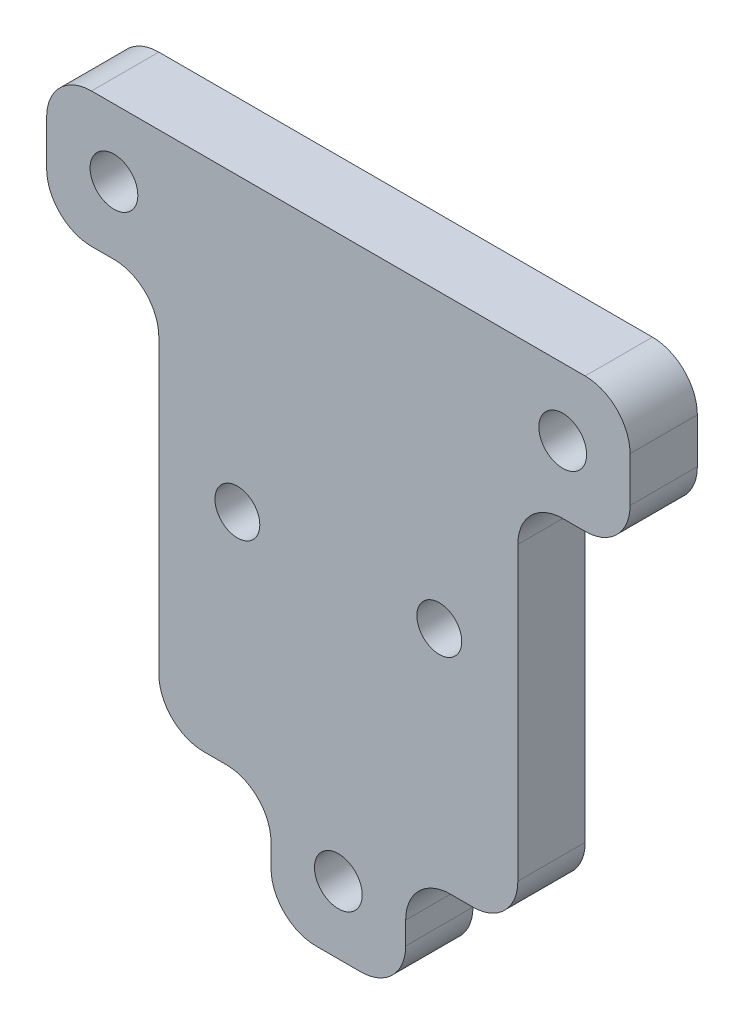
ISO-10303-21;
HEADER;
FILE_DESCRIPTION(('STEP AP214'),'2;1');
FILE_NAME('part.step','',(''),(''),'','','');
FILE_SCHEMA(('AUTOMOTIVE_DESIGN { 1 0 10303 214 1 1 1 1 }'));
ENDSEC;
DATA;
#1=APPLICATION_CONTEXT('core data for automotive mechanical design processes');
#2=APPLICATION_PROTOCOL_DEFINITION('international standard','automotive_design',2000,#1);
#3=PRODUCT_CONTEXT('',#1,'mechanical');
#4=PRODUCT('Part','Part','',(#3));
#5=PRODUCT_RELATED_PRODUCT_CATEGORY('part','',(#4));
#6=PRODUCT_DEFINITION_FORMATION('','',#4);
#7=PRODUCT_DEFINITION_CONTEXT('part definition',#1,'design');
#8=PRODUCT_DEFINITION('design','',#6,#7);
#9=PRODUCT_DEFINITION_SHAPE('','',#8);
#10=(LENGTH_UNIT() NAMED_UNIT(*) SI_UNIT(.MILLI.,.METRE.));
#11=(NAMED_UNIT(*) PLANE_ANGLE_UNIT() SI_UNIT($,.RADIAN.));
#12=(NAMED_UNIT(*) SI_UNIT($,.STERADIAN.) SOLID_ANGLE_UNIT());
#13=UNCERTAINTY_MEASURE_WITH_UNIT(LENGTH_MEASURE(1.E-05),#10,'distance_accuracy_value','');
#14=(GEOMETRIC_REPRESENTATION_CONTEXT(3) GLOBAL_UNCERTAINTY_ASSIGNED_CONTEXT((#13)) GLOBAL_UNIT_ASSIGNED_CONTEXT((#10,
#11,#12)) REPRESENTATION_CONTEXT('',''));
#15=CARTESIAN_POINT('',(0.,0.,0.));
#16=DIRECTION('',(0.,0.,1.));
#17=DIRECTION('',(1.,0.,0.));
#18=AXIS2_PLACEMENT_3D('',#15,#16,#17);
#19=CARTESIAN_POINT('',(0.,0.,0.));
#20=DIRECTION('',(0.,0.,-1.));
#21=DIRECTION('',(-1.,0.,0.));
#22=AXIS2_PLACEMENT_3D('',#19,#20,#21);
#23=PLANE('',#22);
#24=CARTESIAN_POINT('',(11.1125,31.75,0.));
#25=DIRECTION('',(0.,0.,1.));
#26=DIRECTION('',(1.,0.,0.));
#27=AXIS2_PLACEMENT_3D('',#24,#25,#26);
#28=CIRCLE('',#27,3.175);
#29=CARTESIAN_POINT('',(14.2875,31.75,0.));
#30=VERTEX_POINT('',#29);
#31=EDGE_CURVE('E881',#30,#30,#28,.T.);
#32=ORIENTED_EDGE('',*,*,#31,.T.);
#33=EDGE_LOOP('',(#32));
#34=FACE_BOUND('',#33,.T.);
#35=CARTESIAN_POINT('',(39.6875,31.75,0.));
#36=DIRECTION('',(0.,0.,1.));
#37=DIRECTION('',(1.,0.,0.));
#38=AXIS2_PLACEMENT_3D('',#35,#36,#37);
#39=CIRCLE('',#38,3.175);
#40=CARTESIAN_POINT('',(42.8625,31.75,0.));
#41=VERTEX_POINT('',#40);
#42=EDGE_CURVE('E873',#41,#41,#39,.T.);
#43=ORIENTED_EDGE('',*,*,#42,.T.);
#44=EDGE_LOOP('',(#43));
#45=FACE_BOUND('',#44,.T.);
#46=DIRECTION('',(-1.,0.,0.));
#47=VECTOR('',#46,1.);
#48=CARTESIAN_POINT('',(0.,73.025,0.));
#49=LINE('',#48,#47);
#50=CARTESIAN_POINT('',(60.325,73.025,0.));
#51=VERTEX_POINT('',#50);
#52=CARTESIAN_POINT('',(-9.52500000000001,73.025,0.));
#53=VERTEX_POINT('',#52);
#54=EDGE_CURVE('E218',#51,#53,#49,.T.);
#55=ORIENTED_EDGE('',*,*,#54,.F.);
#56=CARTESIAN_POINT('',(60.325,66.675,0.));
#57=DIRECTION('',(0.,0.,-1.));
#58=DIRECTION('',(-1.,0.,0.));
#59=AXIS2_PLACEMENT_3D('',#56,#57,#58);
#60=CIRCLE('',#59,6.35);
#61=CARTESIAN_POINT('',(66.675,66.675,0.));
#62=VERTEX_POINT('',#61);
#63=EDGE_CURVE('E288',#51,#62,#60,.T.);
#64=ORIENTED_EDGE('',*,*,#63,.T.);
#65=DIRECTION('',(0.,1.,0.));
#66=VECTOR('',#65,1.);
#67=CARTESIAN_POINT('',(66.675,73.025,0.));
#68=LINE('',#67,#66);
#69=CARTESIAN_POINT('',(66.675,60.325,0.));
#70=VERTEX_POINT('',#69);
#71=EDGE_CURVE('E483',#70,#62,#68,.T.);
#72=ORIENTED_EDGE('',*,*,#71,.F.);
#73=CARTESIAN_POINT('',(60.325,60.325,0.));
#74=DIRECTION('',(0.,0.,-1.));
#75=DIRECTION('',(-1.,0.,0.));
#76=AXIS2_PLACEMENT_3D('',#73,#74,#75);
#77=CIRCLE('',#76,6.35);
#78=CARTESIAN_POINT('',(60.325,53.975,0.));
#79=VERTEX_POINT('',#78);
#80=EDGE_CURVE('E291',#70,#79,#77,.T.);
#81=ORIENTED_EDGE('',*,*,#80,.T.);
#82=DIRECTION('',(1.,0.,0.));
#83=VECTOR('',#82,1.);
#84=CARTESIAN_POINT('',(50.8,53.975,0.));
#85=LINE('',#84,#83);
#86=CARTESIAN_POINT('',(57.15,53.975,0.));
#87=VERTEX_POINT('',#86);
#88=EDGE_CURVE('E476',#87,#79,#85,.T.);
#89=ORIENTED_EDGE('',*,*,#88,.F.);
#90=CARTESIAN_POINT('',(57.15,47.625,0.));
#91=DIRECTION('',(0.,0.,-1.));
#92=DIRECTION('',(-1.,0.,0.));
#93=AXIS2_PLACEMENT_3D('',#90,#91,#92);
#94=CIRCLE('',#93,6.35);
#95=CARTESIAN_POINT('',(50.8,47.625,0.));
#96=VERTEX_POINT('',#95);
#97=EDGE_CURVE('E390',#87,#96,#94,.F.);
#98=ORIENTED_EDGE('',*,*,#97,.T.);
#99=DIRECTION('',(0.,1.,0.));
#100=VECTOR('',#99,1.);
#101=CARTESIAN_POINT('',(50.8,0.,0.));
#102=LINE('',#101,#100);
#103=CARTESIAN_POINT('',(50.8,6.35,0.));
#104=VERTEX_POINT('',#103);
#105=EDGE_CURVE('E255',#104,#96,#102,.T.);
#106=ORIENTED_EDGE('',*,*,#105,.F.);
#107=CARTESIAN_POINT('',(44.45,6.35,0.));
#108=DIRECTION('',(0.,0.,-1.));
#109=DIRECTION('',(-1.,0.,0.));
#110=AXIS2_PLACEMENT_3D('',#107,#108,#109);
#111=CIRCLE('',#110,6.35);
#112=CARTESIAN_POINT('',(44.45,0.,0.));
#113=VERTEX_POINT('',#112);
#114=EDGE_CURVE('E294',#104,#113,#111,.T.);
#115=ORIENTED_EDGE('',*,*,#114,.T.);
#116=DIRECTION('',(1.,0.,0.));
#117=VECTOR('',#116,1.);
#118=CARTESIAN_POINT('',(0.,0.,0.));
#119=LINE('',#118,#117);
#120=CARTESIAN_POINT('',(41.275,0.,0.));
#121=VERTEX_POINT('',#120);
#122=EDGE_CURVE('E421',#121,#113,#119,.T.);
#123=ORIENTED_EDGE('',*,*,#122,.F.);
#124=CARTESIAN_POINT('',(41.275,-6.35,0.));
#125=DIRECTION('',(0.,0.,-1.));
#126=DIRECTION('',(-1.,0.,0.));
#127=AXIS2_PLACEMENT_3D('',#124,#125,#126);
#128=CIRCLE('',#127,6.35);
#129=CARTESIAN_POINT('',(34.925,-6.35,0.));
#130=VERTEX_POINT('',#129);
#131=EDGE_CURVE('E384',#121,#130,#128,.F.);
#132=ORIENTED_EDGE('',*,*,#131,.T.);
#133=DIRECTION('',(0.,1.,0.));
#134=VECTOR('',#133,1.);
#135=CARTESIAN_POINT('',(34.925,0.,0.));
#136=LINE('',#135,#134);
#137=CARTESIAN_POINT('',(34.925,-9.525,0.));
#138=VERTEX_POINT('',#137);
#139=EDGE_CURVE('E479',#138,#130,#136,.T.);
#140=ORIENTED_EDGE('',*,*,#139,.F.);
#141=CARTESIAN_POINT('',(28.575,-9.525,0.));
#142=DIRECTION('',(0.,0.,-1.));
#143=DIRECTION('',(-1.,0.,0.));
#144=AXIS2_PLACEMENT_3D('',#141,#142,#143);
#145=CIRCLE('',#144,6.35);
#146=CARTESIAN_POINT('',(28.575,-15.875,0.));
#147=VERTEX_POINT('',#146);
#148=EDGE_CURVE('E297',#138,#147,#145,.T.);
#149=ORIENTED_EDGE('',*,*,#148,.T.);
#150=DIRECTION('',(1.,0.,0.));
#151=VECTOR('',#150,1.);
#152=CARTESIAN_POINT('',(15.875,-15.875,0.));
#153=LINE('',#152,#151);
#154=CARTESIAN_POINT('',(22.225,-15.875,0.));
#155=VERTEX_POINT('',#154);
#156=EDGE_CURVE('E818',#155,#147,#153,.T.);
#157=ORIENTED_EDGE('',*,*,#156,.F.);
#158=CARTESIAN_POINT('',(22.225,-9.525,0.));
#159=DIRECTION('',(0.,0.,-1.));
#160=DIRECTION('',(-1.,0.,0.));
#161=AXIS2_PLACEMENT_3D('',#158,#159,#160);
#162=CIRCLE('',#161,6.35);
#163=CARTESIAN_POINT('',(15.875,-9.525,0.));
#164=VERTEX_POINT('',#163);
#165=EDGE_CURVE('E300',#155,#164,#162,.T.);
#166=ORIENTED_EDGE('',*,*,#165,.T.);
#167=DIRECTION('',(0.,-1.,0.));
#168=VECTOR('',#167,1.);
#169=CARTESIAN_POINT('',(15.875,0.,0.));
#170=LINE('',#169,#168);
#171=CARTESIAN_POINT('',(15.875,-6.35,0.));
#172=VERTEX_POINT('',#171);
#173=EDGE_CURVE('E470',#172,#164,#170,.T.);
#174=ORIENTED_EDGE('',*,*,#173,.F.);
#175=CARTESIAN_POINT('',(9.525,-6.35,0.));
#176=DIRECTION('',(0.,0.,-1.));
#177=DIRECTION('',(-1.,0.,0.));
#178=AXIS2_PLACEMENT_3D('',#175,#176,#177);
#179=CIRCLE('',#178,6.35);
#180=CARTESIAN_POINT('',(9.525,0.,0.));
#181=VERTEX_POINT('',#180);
#182=EDGE_CURVE('E378',#172,#181,#179,.F.);
#183=ORIENTED_EDGE('',*,*,#182,.T.);
#184=CARTESIAN_POINT('',(6.35,0.,0.));
#185=VERTEX_POINT('',#184);
#186=EDGE_CURVE('E428',#185,#181,#119,.T.);
#187=ORIENTED_EDGE('',*,*,#186,.F.);
#188=CARTESIAN_POINT('',(6.35,6.35,0.));
#189=DIRECTION('',(0.,0.,-1.));
#190=DIRECTION('',(-1.,0.,0.));
#191=AXIS2_PLACEMENT_3D('',#188,#189,#190);
#192=CIRCLE('',#191,6.35);
#193=CARTESIAN_POINT('',(0.,6.35,0.));
#194=VERTEX_POINT('',#193);
#195=EDGE_CURVE('E227',#185,#194,#192,.T.);
#196=ORIENTED_EDGE('',*,*,#195,.T.);
#197=DIRECTION('',(0.,-1.,0.));
#198=VECTOR('',#197,1.);
#199=CARTESIAN_POINT('',(0.,0.,0.));
#200=LINE('',#199,#198);
#201=CARTESIAN_POINT('',(0.,47.625,0.));
#202=VERTEX_POINT('',#201);
#203=EDGE_CURVE('E416',#202,#194,#200,.T.);
#204=ORIENTED_EDGE('',*,*,#203,.F.);
#205=CARTESIAN_POINT('',(-6.35,47.625,0.));
#206=DIRECTION('',(0.,0.,-1.));
#207=DIRECTION('',(-1.,0.,0.));
#208=AXIS2_PLACEMENT_3D('',#205,#206,#207);
#209=CIRCLE('',#208,6.35);
#210=CARTESIAN_POINT('',(-6.35,53.975,0.));
#211=VERTEX_POINT('',#210);
#212=EDGE_CURVE('E13',#202,#211,#209,.F.);
#213=ORIENTED_EDGE('',*,*,#212,.T.);
#214=DIRECTION('',(1.,0.,0.));
#215=VECTOR('',#214,1.);
#216=CARTESIAN_POINT('',(0.,53.975,0.));
#217=LINE('',#216,#215);
#218=CARTESIAN_POINT('',(-9.52500000000001,53.975,0.));
#219=VERTEX_POINT('',#218);
#220=EDGE_CURVE('E413',#219,#211,#217,.T.);
#221=ORIENTED_EDGE('',*,*,#220,.F.);
#222=CARTESIAN_POINT('',(-9.52500000000001,60.325,0.));
#223=DIRECTION('',(0.,0.,-1.));
#224=DIRECTION('',(-1.,0.,0.));
#225=AXIS2_PLACEMENT_3D('',#222,#223,#224);
#226=CIRCLE('',#225,6.35);
#227=CARTESIAN_POINT('',(-15.875,60.325,0.));
#228=VERTEX_POINT('',#227);
#229=EDGE_CURVE('E285',#219,#228,#226,.T.);
#230=ORIENTED_EDGE('',*,*,#229,.T.);
#231=DIRECTION('',(0.,-1.,0.));
#232=VECTOR('',#231,1.);
#233=CARTESIAN_POINT('',(-15.875,73.025,0.));
#234=LINE('',#233,#232);
#235=CARTESIAN_POINT('',(-15.875,66.675,0.));
#236=VERTEX_POINT('',#235);
#237=EDGE_CURVE('E221',#236,#228,#234,.T.);
#238=ORIENTED_EDGE('',*,*,#237,.F.);
#239=CARTESIAN_POINT('',(-9.52500000000001,66.675,0.));
#240=DIRECTION('',(0.,0.,-1.));
#241=DIRECTION('',(-1.,0.,0.));
#242=AXIS2_PLACEMENT_3D('',#239,#240,#241);
#243=CIRCLE('',#242,6.35);
#244=EDGE_CURVE('E215',#236,#53,#243,.T.);
#245=ORIENTED_EDGE('',*,*,#244,.T.);
#246=EDGE_LOOP('',(#55,#64,#72,#81,#89,#98,#106,#115,#123,#132,#140,#149,#157,#166,#174,#183,
#187,#196,#204,#213,#221,#230,#238,#245));
#247=FACE_BOUND('',#246,.T.);
#248=CARTESIAN_POINT('',(-6.35000000000001,63.5,0.));
#249=DIRECTION('',(0.,0.,1.));
#250=DIRECTION('',(1.,0.,0.));
#251=AXIS2_PLACEMENT_3D('',#248,#249,#250);
#252=CIRCLE('',#251,3.3782);
#253=CARTESIAN_POINT('',(-2.97180000000001,63.5,0.));
#254=VERTEX_POINT('',#253);
#255=EDGE_CURVE('E865',#254,#254,#252,.T.);
#256=ORIENTED_EDGE('',*,*,#255,.T.);
#257=EDGE_LOOP('',(#256));
#258=FACE_BOUND('',#257,.T.);
#259=CARTESIAN_POINT('',(57.15,63.5,0.));
#260=DIRECTION('',(0.,0.,1.));
#261=DIRECTION('',(1.,0.,0.));
#262=AXIS2_PLACEMENT_3D('',#259,#260,#261);
#263=CIRCLE('',#262,3.3782);
#264=CARTESIAN_POINT('',(60.5282,63.5,0.));
#265=VERTEX_POINT('',#264);
#266=EDGE_CURVE('E857',#265,#265,#263,.T.);
#267=ORIENTED_EDGE('',*,*,#266,.T.);
#268=EDGE_LOOP('',(#267));
#269=FACE_BOUND('',#268,.T.);
#270=CARTESIAN_POINT('',(25.4,-6.35,0.));
#271=DIRECTION('',(0.,0.,1.));
#272=DIRECTION('',(1.,0.,0.));
#273=AXIS2_PLACEMENT_3D('',#270,#271,#272);
#274=CIRCLE('',#273,3.3782);
#275=CARTESIAN_POINT('',(28.7782,-6.35,0.));
#276=VERTEX_POINT('',#275);
#277=EDGE_CURVE('E832',#276,#276,#274,.T.);
#278=ORIENTED_EDGE('',*,*,#277,.T.);
#279=EDGE_LOOP('',(#278));
#280=FACE_BOUND('',#279,.T.);
#281=ADVANCED_FACE('F54',(#34,#45,#247,#258,#269,#280),#23,.T.);
#282=CARTESIAN_POINT('',(0.,0.,9.525));
#283=DIRECTION('',(0.,1.,0.));
#284=DIRECTION('',(0.,0.,1.));
#285=AXIS2_PLACEMENT_3D('',#282,#283,#284);
#286=PLANE('',#285);
#287=DIRECTION('',(1.,0.,0.));
#288=VECTOR('',#287,1.);
#289=CARTESIAN_POINT('',(0.,0.,9.525));
#290=LINE('',#289,#288);
#291=CARTESIAN_POINT('',(41.275,0.,9.525));
#292=VERTEX_POINT('',#291);
#293=CARTESIAN_POINT('',(44.45,0.,9.525));
#294=VERTEX_POINT('',#293);
#295=EDGE_CURVE('E409',#292,#294,#290,.T.);
#296=ORIENTED_EDGE('',*,*,#295,.F.);
#297=DIRECTION('',(0.,0.,1.));
#298=VECTOR('',#297,1.);
#299=CARTESIAN_POINT('',(41.275,0.,9.525));
#300=LINE('',#299,#298);
#301=EDGE_CURVE('E342',#292,#121,#300,.F.);
#302=ORIENTED_EDGE('',*,*,#301,.T.);
#303=ORIENTED_EDGE('',*,*,#122,.T.);
#304=DIRECTION('',(0.,0.,-1.));
#305=VECTOR('',#304,1.);
#306=CARTESIAN_POINT('',(44.45,0.,9.525));
#307=LINE('',#306,#305);
#308=EDGE_CURVE('E339',#113,#294,#307,.F.);
#309=ORIENTED_EDGE('',*,*,#308,.T.);
#310=EDGE_LOOP('',(#296,#302,#303,#309));
#311=FACE_BOUND('',#310,.T.);
#312=ADVANCED_FACE('F444',(#311),#286,.F.);
#313=CARTESIAN_POINT('',(0.,0.,9.525));
#314=DIRECTION('',(1.,0.,0.));
#315=DIRECTION('',(0.,0.,-1.));
#316=AXIS2_PLACEMENT_3D('',#313,#314,#315);
#317=PLANE('',#316);
#318=ORIENTED_EDGE('',*,*,#203,.T.);
#319=DIRECTION('',(0.,0.,-1.));
#320=VECTOR('',#319,1.);
#321=CARTESIAN_POINT('',(0.,6.35,9.525));
#322=LINE('',#321,#320);
#323=CARTESIAN_POINT('',(0.,6.35,9.525));
#324=VERTEX_POINT('',#323);
#325=EDGE_CURVE('E315',#194,#324,#322,.F.);
#326=ORIENTED_EDGE('',*,*,#325,.T.);
#327=DIRECTION('',(0.,-1.,0.));
#328=VECTOR('',#327,1.);
#329=CARTESIAN_POINT('',(0.,0.,9.525));
#330=LINE('',#329,#328);
#331=CARTESIAN_POINT('',(0.,47.625,9.525));
#332=VERTEX_POINT('',#331);
#333=EDGE_CURVE('E399',#332,#324,#330,.T.);
#334=ORIENTED_EDGE('',*,*,#333,.F.);
#335=DIRECTION('',(0.,0.,1.));
#336=VECTOR('',#335,1.);
#337=CARTESIAN_POINT('',(0.,47.625,9.525));
#338=LINE('',#337,#336);
#339=EDGE_CURVE('E312',#332,#202,#338,.F.);
#340=ORIENTED_EDGE('',*,*,#339,.T.);
#341=EDGE_LOOP('',(#318,#326,#334,#340));
#342=FACE_BOUND('',#341,.T.);
#343=ADVANCED_FACE('F406',(#342),#317,.F.);
#344=CARTESIAN_POINT('',(6.35,0.,9.525));
#345=VERTEX_POINT('',#344);
#346=CARTESIAN_POINT('',(9.525,0.,9.525));
#347=VERTEX_POINT('',#346);
#348=EDGE_CURVE('E252',#345,#347,#290,.T.);
#349=ORIENTED_EDGE('',*,*,#348,.F.);
#350=DIRECTION('',(0.,0.,-1.));
#351=VECTOR('',#350,1.);
#352=CARTESIAN_POINT('',(6.35,0.,9.525));
#353=LINE('',#352,#351);
#354=EDGE_CURVE('E308',#345,#185,#353,.T.);
#355=ORIENTED_EDGE('',*,*,#354,.T.);
#356=ORIENTED_EDGE('',*,*,#186,.T.);
#357=DIRECTION('',(0.,0.,1.));
#358=VECTOR('',#357,1.);
#359=CARTESIAN_POINT('',(9.525,0.,9.525));
#360=LINE('',#359,#358);
#361=EDGE_CURVE('E226',#181,#347,#360,.T.);
#362=ORIENTED_EDGE('',*,*,#361,.T.);
#363=EDGE_LOOP('',(#349,#355,#356,#362));
#364=FACE_BOUND('',#363,.T.);
#365=ADVANCED_FACE('F524',(#364),#286,.F.);
#366=CARTESIAN_POINT('',(50.8,0.,9.525));
#367=DIRECTION('',(-1.,0.,0.));
#368=DIRECTION('',(0.,0.,1.));
#369=AXIS2_PLACEMENT_3D('',#366,#367,#368);
#370=PLANE('',#369);
#371=DIRECTION('',(0.,1.,0.));
#372=VECTOR('',#371,1.);
#373=CARTESIAN_POINT('',(50.8,0.,9.525));
#374=LINE('',#373,#372);
#375=CARTESIAN_POINT('',(50.8,6.35,9.525));
#376=VERTEX_POINT('',#375);
#377=CARTESIAN_POINT('',(50.8,47.625,9.525));
#378=VERTEX_POINT('',#377);
#379=EDGE_CURVE('E244',#376,#378,#374,.T.);
#380=ORIENTED_EDGE('',*,*,#379,.F.);
#381=DIRECTION('',(0.,0.,-1.));
#382=VECTOR('',#381,1.);
#383=CARTESIAN_POINT('',(50.8,6.35,9.525));
#384=LINE('',#383,#382);
#385=EDGE_CURVE('E349',#376,#104,#384,.T.);
#386=ORIENTED_EDGE('',*,*,#385,.T.);
#387=ORIENTED_EDGE('',*,*,#105,.T.);
#388=DIRECTION('',(0.,0.,1.));
#389=VECTOR('',#388,1.);
#390=CARTESIAN_POINT('',(50.8,47.625,9.525));
#391=LINE('',#390,#389);
#392=EDGE_CURVE('E345',#96,#378,#391,.T.);
#393=ORIENTED_EDGE('',*,*,#392,.T.);
#394=EDGE_LOOP('',(#380,#386,#387,#393));
#395=FACE_BOUND('',#394,.T.);
#396=ADVANCED_FACE('F453',(#395),#370,.F.);
#397=CARTESIAN_POINT('',(0.,0.,9.525));
#398=DIRECTION('',(0.,0.,-1.));
#399=DIRECTION('',(-1.,0.,0.));
#400=AXIS2_PLACEMENT_3D('',#397,#398,#399);
#401=PLANE('',#400);
#402=CARTESIAN_POINT('',(11.1125,31.75,9.525));
#403=DIRECTION('',(0.,0.,1.));
#404=DIRECTION('',(1.,0.,0.));
#405=AXIS2_PLACEMENT_3D('',#402,#403,#404);
#406=CIRCLE('',#405,3.17499999999999);
#407=CARTESIAN_POINT('',(14.2875,31.75,9.525));
#408=VERTEX_POINT('',#407);
#409=EDGE_CURVE('E884',#408,#408,#406,.T.);
#410=ORIENTED_EDGE('',*,*,#409,.F.);
#411=EDGE_LOOP('',(#410));
#412=FACE_BOUND('',#411,.T.);
#413=CARTESIAN_POINT('',(39.6875,31.75,9.525));
#414=DIRECTION('',(0.,0.,1.));
#415=DIRECTION('',(1.,0.,0.));
#416=AXIS2_PLACEMENT_3D('',#413,#414,#415);
#417=CIRCLE('',#416,3.17499999999998);
#418=CARTESIAN_POINT('',(42.8625,31.75,9.525));
#419=VERTEX_POINT('',#418);
#420=EDGE_CURVE('E877',#419,#419,#417,.T.);
#421=ORIENTED_EDGE('',*,*,#420,.F.);
#422=EDGE_LOOP('',(#421));
#423=FACE_BOUND('',#422,.T.);
#424=CARTESIAN_POINT('',(-6.35000000000001,63.5,9.525));
#425=DIRECTION('',(0.,0.,1.));
#426=DIRECTION('',(1.,0.,0.));
#427=AXIS2_PLACEMENT_3D('',#424,#425,#426);
#428=CIRCLE('',#427,3.3782);
#429=CARTESIAN_POINT('',(-2.97180000000001,63.5,9.525));
#430=VERTEX_POINT('',#429);
#431=EDGE_CURVE('E869',#430,#430,#428,.T.);
#432=ORIENTED_EDGE('',*,*,#431,.F.);
#433=EDGE_LOOP('',(#432));
#434=FACE_BOUND('',#433,.T.);
#435=CARTESIAN_POINT('',(57.15,63.5,9.525));
#436=DIRECTION('',(0.,0.,1.));
#437=DIRECTION('',(1.,0.,0.));
#438=AXIS2_PLACEMENT_3D('',#435,#436,#437);
#439=CIRCLE('',#438,3.3782);
#440=CARTESIAN_POINT('',(60.5282,63.5,9.525));
#441=VERTEX_POINT('',#440);
#442=EDGE_CURVE('E861',#441,#441,#439,.T.);
#443=ORIENTED_EDGE('',*,*,#442,.F.);
#444=EDGE_LOOP('',(#443));
#445=FACE_BOUND('',#444,.T.);
#446=CARTESIAN_POINT('',(25.4,-6.35,9.525));
#447=DIRECTION('',(0.,0.,1.));
#448=DIRECTION('',(1.,0.,0.));
#449=AXIS2_PLACEMENT_3D('',#446,#447,#448);
#450=CIRCLE('',#449,3.3782);
#451=CARTESIAN_POINT('',(28.7782,-6.35,9.525));
#452=VERTEX_POINT('',#451);
#453=EDGE_CURVE('E837',#452,#452,#450,.T.);
#454=ORIENTED_EDGE('',*,*,#453,.F.);
#455=EDGE_LOOP('',(#454));
#456=FACE_BOUND('',#455,.T.);
#457=CARTESIAN_POINT('',(60.325,66.675,9.525));
#458=DIRECTION('',(0.,0.,-1.));
#459=DIRECTION('',(-1.,0.,0.));
#460=AXIS2_PLACEMENT_3D('',#457,#458,#459);
#461=CIRCLE('',#460,6.35);
#462=CARTESIAN_POINT('',(66.675,66.675,9.525));
#463=VERTEX_POINT('',#462);
#464=CARTESIAN_POINT('',(60.325,73.025,9.525));
#465=VERTEX_POINT('',#464);
#466=EDGE_CURVE('E249',#463,#465,#461,.F.);
#467=ORIENTED_EDGE('',*,*,#466,.T.);
#468=DIRECTION('',(-1.,0.,0.));
#469=VECTOR('',#468,1.);
#470=CARTESIAN_POINT('',(0.,73.025,9.525));
#471=LINE('',#470,#469);
#472=CARTESIAN_POINT('',(-9.52500000000001,73.025,9.525));
#473=VERTEX_POINT('',#472);
#474=EDGE_CURVE('E487',#465,#473,#471,.T.);
#475=ORIENTED_EDGE('',*,*,#474,.T.);
#476=CARTESIAN_POINT('',(-9.52500000000001,66.675,9.525));
#477=DIRECTION('',(0.,0.,-1.));
#478=DIRECTION('',(-1.,0.,0.));
#479=AXIS2_PLACEMENT_3D('',#476,#477,#478);
#480=CIRCLE('',#479,6.35);
#481=CARTESIAN_POINT('',(-15.875,66.675,9.525));
#482=VERTEX_POINT('',#481);
#483=EDGE_CURVE('E241',#473,#482,#480,.F.);
#484=ORIENTED_EDGE('',*,*,#483,.T.);
#485=DIRECTION('',(0.,-1.,0.));
#486=VECTOR('',#485,1.);
#487=CARTESIAN_POINT('',(-15.875,73.025,9.525));
#488=LINE('',#487,#486);
#489=CARTESIAN_POINT('',(-15.875,60.325,9.525));
#490=VERTEX_POINT('',#489);
#491=EDGE_CURVE('E492',#482,#490,#488,.T.);
#492=ORIENTED_EDGE('',*,*,#491,.T.);
#493=CARTESIAN_POINT('',(-9.52500000000001,60.325,9.525));
#494=DIRECTION('',(0.,0.,-1.));
#495=DIRECTION('',(-1.,0.,0.));
#496=AXIS2_PLACEMENT_3D('',#493,#494,#495);
#497=CIRCLE('',#496,6.35);
#498=CARTESIAN_POINT('',(-9.52500000000001,53.975,9.525));
#499=VERTEX_POINT('',#498);
#500=EDGE_CURVE('E243',#490,#499,#497,.F.);
#501=ORIENTED_EDGE('',*,*,#500,.T.);
#502=DIRECTION('',(1.,0.,0.));
#503=VECTOR('',#502,1.);
#504=CARTESIAN_POINT('',(0.,53.975,9.525));
#505=LINE('',#504,#503);
#506=CARTESIAN_POINT('',(-6.35,53.975,9.525));
#507=VERTEX_POINT('',#506);
#508=EDGE_CURVE('E238',#499,#507,#505,.T.);
#509=ORIENTED_EDGE('',*,*,#508,.T.);
#510=CARTESIAN_POINT('',(-6.35,47.625,9.525));
#511=DIRECTION('',(0.,0.,-1.));
#512=DIRECTION('',(-1.,0.,0.));
#513=AXIS2_PLACEMENT_3D('',#510,#511,#512);
#514=CIRCLE('',#513,6.35);
#515=EDGE_CURVE('E63',#507,#332,#514,.T.);
#516=ORIENTED_EDGE('',*,*,#515,.T.);
#517=ORIENTED_EDGE('',*,*,#333,.T.);
#518=CARTESIAN_POINT('',(6.35,6.35,9.525));
#519=DIRECTION('',(0.,0.,-1.));
#520=DIRECTION('',(-1.,0.,0.));
#521=AXIS2_PLACEMENT_3D('',#518,#519,#520);
#522=CIRCLE('',#521,6.35);
#523=EDGE_CURVE('E273',#324,#345,#522,.F.);
#524=ORIENTED_EDGE('',*,*,#523,.T.);
#525=ORIENTED_EDGE('',*,*,#348,.T.);
#526=CARTESIAN_POINT('',(9.525,-6.35,9.525));
#527=DIRECTION('',(0.,0.,-1.));
#528=DIRECTION('',(-1.,0.,0.));
#529=AXIS2_PLACEMENT_3D('',#526,#527,#528);
#530=CIRCLE('',#529,6.35);
#531=CARTESIAN_POINT('',(15.875,-6.35,9.525));
#532=VERTEX_POINT('',#531);
#533=EDGE_CURVE('E375',#347,#532,#530,.T.);
#534=ORIENTED_EDGE('',*,*,#533,.T.);
#535=DIRECTION('',(0.,-1.,0.));
#536=VECTOR('',#535,1.);
#537=CARTESIAN_POINT('',(15.875,0.,9.525));
#538=LINE('',#537,#536);
#539=CARTESIAN_POINT('',(15.875,-9.525,9.525));
#540=VERTEX_POINT('',#539);
#541=EDGE_CURVE('E812',#532,#540,#538,.T.);
#542=ORIENTED_EDGE('',*,*,#541,.T.);
#543=CARTESIAN_POINT('',(22.225,-9.525,9.525));
#544=DIRECTION('',(0.,0.,-1.));
#545=DIRECTION('',(-1.,0.,0.));
#546=AXIS2_PLACEMENT_3D('',#543,#544,#545);
#547=CIRCLE('',#546,6.35);
#548=CARTESIAN_POINT('',(22.225,-15.875,9.525));
#549=VERTEX_POINT('',#548);
#550=EDGE_CURVE('E270',#540,#549,#547,.F.);
#551=ORIENTED_EDGE('',*,*,#550,.T.);
#552=DIRECTION('',(1.,0.,0.));
#553=VECTOR('',#552,1.);
#554=CARTESIAN_POINT('',(15.875,-15.875,9.525));
#555=LINE('',#554,#553);
#556=CARTESIAN_POINT('',(28.575,-15.875,9.525));
#557=VERTEX_POINT('',#556);
#558=EDGE_CURVE('E805',#549,#557,#555,.T.);
#559=ORIENTED_EDGE('',*,*,#558,.T.);
#560=CARTESIAN_POINT('',(28.575,-9.525,9.525));
#561=DIRECTION('',(0.,0.,-1.));
#562=DIRECTION('',(-1.,0.,0.));
#563=AXIS2_PLACEMENT_3D('',#560,#561,#562);
#564=CIRCLE('',#563,6.35);
#565=CARTESIAN_POINT('',(34.925,-9.525,9.525));
#566=VERTEX_POINT('',#565);
#567=EDGE_CURVE('E267',#557,#566,#564,.F.);
#568=ORIENTED_EDGE('',*,*,#567,.T.);
#569=DIRECTION('',(0.,1.,0.));
#570=VECTOR('',#569,1.);
#571=CARTESIAN_POINT('',(34.925,0.,9.525));
#572=LINE('',#571,#570);
#573=CARTESIAN_POINT('',(34.925,-6.35,9.525));
#574=VERTEX_POINT('',#573);
#575=EDGE_CURVE('E811',#566,#574,#572,.T.);
#576=ORIENTED_EDGE('',*,*,#575,.T.);
#577=CARTESIAN_POINT('',(41.275,-6.35,9.525));
#578=DIRECTION('',(0.,0.,-1.));
#579=DIRECTION('',(-1.,0.,0.));
#580=AXIS2_PLACEMENT_3D('',#577,#578,#579);
#581=CIRCLE('',#580,6.35);
#582=EDGE_CURVE('E381',#574,#292,#581,.T.);
#583=ORIENTED_EDGE('',*,*,#582,.T.);
#584=ORIENTED_EDGE('',*,*,#295,.T.);
#585=CARTESIAN_POINT('',(44.45,6.35,9.525));
#586=DIRECTION('',(0.,0.,-1.));
#587=DIRECTION('',(-1.,0.,0.));
#588=AXIS2_PLACEMENT_3D('',#585,#586,#587);
#589=CIRCLE('',#588,6.35);
#590=EDGE_CURVE('E264',#294,#376,#589,.F.);
#591=ORIENTED_EDGE('',*,*,#590,.T.);
#592=ORIENTED_EDGE('',*,*,#379,.T.);
#593=CARTESIAN_POINT('',(57.15,47.625,9.525));
#594=DIRECTION('',(0.,0.,-1.));
#595=DIRECTION('',(-1.,0.,0.));
#596=AXIS2_PLACEMENT_3D('',#593,#594,#595);
#597=CIRCLE('',#596,6.35);
#598=CARTESIAN_POINT('',(57.15,53.975,9.525));
#599=VERTEX_POINT('',#598);
#600=EDGE_CURVE('E387',#378,#599,#597,.T.);
#601=ORIENTED_EDGE('',*,*,#600,.T.);
#602=DIRECTION('',(1.,0.,0.));
#603=VECTOR('',#602,1.);
#604=CARTESIAN_POINT('',(50.8,53.975,9.525));
#605=LINE('',#604,#603);
#606=CARTESIAN_POINT('',(60.325,53.975,9.525));
#607=VERTEX_POINT('',#606);
#608=EDGE_CURVE('E462',#599,#607,#605,.T.);
#609=ORIENTED_EDGE('',*,*,#608,.T.);
#610=CARTESIAN_POINT('',(60.325,60.325,9.525));
#611=DIRECTION('',(0.,0.,-1.));
#612=DIRECTION('',(-1.,0.,0.));
#613=AXIS2_PLACEMENT_3D('',#610,#611,#612);
#614=CIRCLE('',#613,6.35);
#615=CARTESIAN_POINT('',(66.675,60.325,9.525));
#616=VERTEX_POINT('',#615);
#617=EDGE_CURVE('E261',#607,#616,#614,.F.);
#618=ORIENTED_EDGE('',*,*,#617,.T.);
#619=DIRECTION('',(0.,1.,0.));
#620=VECTOR('',#619,1.);
#621=CARTESIAN_POINT('',(66.675,73.025,9.525));
#622=LINE('',#621,#620);
#623=EDGE_CURVE('E469',#616,#463,#622,.T.);
#624=ORIENTED_EDGE('',*,*,#623,.T.);
#625=EDGE_LOOP('',(#467,#475,#484,#492,#501,#509,#516,#517,#524,#525,#534,#542,#551,#559,#568,
#576,#583,#584,#591,#592,#601,#609,#618,#624));
#626=FACE_BOUND('',#625,.T.);
#627=ADVANCED_FACE('F398',(#412,#423,#434,#445,#456,#626),#401,.F.);
#628=CARTESIAN_POINT('',(0.,73.025,-24.7975427210036));
#629=DIRECTION('',(0.,1.,0.));
#630=DIRECTION('',(0.,0.,1.));
#631=AXIS2_PLACEMENT_3D('',#628,#629,#630);
#632=PLANE('',#631);
#633=ORIENTED_EDGE('',*,*,#474,.F.);
#634=DIRECTION('',(0.,0.,1.));
#635=VECTOR('',#634,1.);
#636=CARTESIAN_POINT('',(60.325,73.025,-24.7975427210036));
#637=LINE('',#636,#635);
#638=EDGE_CURVE('E235',#465,#51,#637,.F.);
#639=ORIENTED_EDGE('',*,*,#638,.T.);
#640=ORIENTED_EDGE('',*,*,#54,.T.);
#641=DIRECTION('',(0.,0.,1.));
#642=VECTOR('',#641,1.);
#643=CARTESIAN_POINT('',(-9.52500000000001,73.025,-24.7975427210036));
#644=LINE('',#643,#642);
#645=EDGE_CURVE('E232',#53,#473,#644,.T.);
#646=ORIENTED_EDGE('',*,*,#645,.T.);
#647=EDGE_LOOP('',(#633,#639,#640,#646));
#648=FACE_BOUND('',#647,.T.);
#649=ADVANCED_FACE('F231',(#648),#632,.T.);
#650=CARTESIAN_POINT('',(-15.875,73.025,-24.7975427210036));
#651=DIRECTION('',(-1.,0.,0.));
#652=DIRECTION('',(0.,-1.,0.));
#653=AXIS2_PLACEMENT_3D('',#650,#651,#652);
#654=PLANE('',#653);
#655=ORIENTED_EDGE('',*,*,#491,.F.);
#656=DIRECTION('',(0.,0.,1.));
#657=VECTOR('',#656,1.);
#658=CARTESIAN_POINT('',(-15.875,66.675,-24.7975427210036));
#659=LINE('',#658,#657);
#660=EDGE_CURVE('E282',#482,#236,#659,.F.);
#661=ORIENTED_EDGE('',*,*,#660,.T.);
#662=ORIENTED_EDGE('',*,*,#237,.T.);
#663=DIRECTION('',(0.,0.,1.));
#664=VECTOR('',#663,1.);
#665=CARTESIAN_POINT('',(-15.875,60.325,-24.7975427210036));
#666=LINE('',#665,#664);
#667=EDGE_CURVE('E278',#228,#490,#666,.T.);
#668=ORIENTED_EDGE('',*,*,#667,.T.);
#669=EDGE_LOOP('',(#655,#661,#662,#668));
#670=FACE_BOUND('',#669,.T.);
#671=ADVANCED_FACE('F627',(#670),#654,.T.);
#672=CARTESIAN_POINT('',(0.,53.975,-24.7975427210036));
#673=DIRECTION('',(0.,-1.,0.));
#674=DIRECTION('',(0.,0.,-1.));
#675=AXIS2_PLACEMENT_3D('',#672,#673,#674);
#676=PLANE('',#675);
#677=ORIENTED_EDGE('',*,*,#220,.T.);
#678=DIRECTION('',(0.,0.,1.));
#679=VECTOR('',#678,1.);
#680=CARTESIAN_POINT('',(-6.35,53.975,-24.7975427210036));
#681=LINE('',#680,#679);
#682=EDGE_CURVE('E371',#211,#507,#681,.T.);
#683=ORIENTED_EDGE('',*,*,#682,.T.);
#684=ORIENTED_EDGE('',*,*,#508,.F.);
#685=DIRECTION('',(0.,0.,1.));
#686=VECTOR('',#685,1.);
#687=CARTESIAN_POINT('',(-9.52500000000001,53.975,-24.7975427210036));
#688=LINE('',#687,#686);
#689=EDGE_CURVE('E75',#499,#219,#688,.F.);
#690=ORIENTED_EDGE('',*,*,#689,.T.);
#691=EDGE_LOOP('',(#677,#683,#684,#690));
#692=FACE_BOUND('',#691,.T.);
#693=ADVANCED_FACE('F412',(#692),#676,.T.);
#694=CARTESIAN_POINT('',(50.8,53.975,-24.7975427210036));
#695=DIRECTION('',(0.,-1.,0.));
#696=DIRECTION('',(1.,0.,0.));
#697=AXIS2_PLACEMENT_3D('',#694,#695,#696);
#698=PLANE('',#697);
#699=ORIENTED_EDGE('',*,*,#608,.F.);
#700=DIRECTION('',(0.,0.,1.));
#701=VECTOR('',#700,1.);
#702=CARTESIAN_POINT('',(57.15,53.975,-24.7975427210036));
#703=LINE('',#702,#701);
#704=EDGE_CURVE('E357',#599,#87,#703,.F.);
#705=ORIENTED_EDGE('',*,*,#704,.T.);
#706=ORIENTED_EDGE('',*,*,#88,.T.);
#707=DIRECTION('',(0.,0.,1.));
#708=VECTOR('',#707,1.);
#709=CARTESIAN_POINT('',(60.325,53.975,-24.7975427210036));
#710=LINE('',#709,#708);
#711=EDGE_CURVE('E353',#79,#607,#710,.T.);
#712=ORIENTED_EDGE('',*,*,#711,.T.);
#713=EDGE_LOOP('',(#699,#705,#706,#712));
#714=FACE_BOUND('',#713,.T.);
#715=ADVANCED_FACE('F464',(#714),#698,.T.);
#716=CARTESIAN_POINT('',(66.675,73.025,-24.7975427210036));
#717=DIRECTION('',(1.,0.,0.));
#718=DIRECTION('',(0.,0.,-1.));
#719=AXIS2_PLACEMENT_3D('',#716,#717,#718);
#720=PLANE('',#719);
#721=ORIENTED_EDGE('',*,*,#623,.F.);
#722=DIRECTION('',(0.,0.,1.));
#723=VECTOR('',#722,1.);
#724=CARTESIAN_POINT('',(66.675,60.325,-24.7975427210036));
#725=LINE('',#724,#723);
#726=EDGE_CURVE('E364',#616,#70,#725,.F.);
#727=ORIENTED_EDGE('',*,*,#726,.T.);
#728=ORIENTED_EDGE('',*,*,#71,.T.);
#729=DIRECTION('',(0.,0.,1.));
#730=VECTOR('',#729,1.);
#731=CARTESIAN_POINT('',(66.675,66.675,-24.7975427210036));
#732=LINE('',#731,#730);
#733=EDGE_CURVE('E360',#62,#463,#732,.T.);
#734=ORIENTED_EDGE('',*,*,#733,.T.);
#735=EDGE_LOOP('',(#721,#727,#728,#734));
#736=FACE_BOUND('',#735,.T.);
#737=ADVANCED_FACE('F505',(#736),#720,.T.);
#738=CARTESIAN_POINT('',(15.875,-15.875,-24.7975427210036));
#739=DIRECTION('',(0.,-1.,0.));
#740=DIRECTION('',(0.,0.,-1.));
#741=AXIS2_PLACEMENT_3D('',#738,#739,#740);
#742=PLANE('',#741);
#743=ORIENTED_EDGE('',*,*,#558,.F.);
#744=DIRECTION('',(0.,0.,1.));
#745=VECTOR('',#744,1.);
#746=CARTESIAN_POINT('',(22.225,-15.875,-24.7975427210036));
#747=LINE('',#746,#745);
#748=EDGE_CURVE('E329',#549,#155,#747,.F.);
#749=ORIENTED_EDGE('',*,*,#748,.T.);
#750=ORIENTED_EDGE('',*,*,#156,.T.);
#751=DIRECTION('',(0.,0.,1.));
#752=VECTOR('',#751,1.);
#753=CARTESIAN_POINT('',(28.575,-15.875,-24.7975427210036));
#754=LINE('',#753,#752);
#755=EDGE_CURVE('E325',#147,#557,#754,.T.);
#756=ORIENTED_EDGE('',*,*,#755,.T.);
#757=EDGE_LOOP('',(#743,#749,#750,#756));
#758=FACE_BOUND('',#757,.T.);
#759=ADVANCED_FACE('F732',(#758),#742,.T.);
#760=CARTESIAN_POINT('',(34.925,0.,-24.7975427210036));
#761=DIRECTION('',(1.,0.,0.));
#762=DIRECTION('',(0.,0.,-1.));
#763=AXIS2_PLACEMENT_3D('',#760,#761,#762);
#764=PLANE('',#763);
#765=ORIENTED_EDGE('',*,*,#575,.F.);
#766=DIRECTION('',(0.,0.,1.));
#767=VECTOR('',#766,1.);
#768=CARTESIAN_POINT('',(34.925,-9.525,-24.7975427210036));
#769=LINE('',#768,#767);
#770=EDGE_CURVE('E336',#566,#138,#769,.F.);
#771=ORIENTED_EDGE('',*,*,#770,.T.);
#772=ORIENTED_EDGE('',*,*,#139,.T.);
#773=DIRECTION('',(0.,0.,1.));
#774=VECTOR('',#773,1.);
#775=CARTESIAN_POINT('',(34.925,-6.35,-24.7975427210036));
#776=LINE('',#775,#774);
#777=EDGE_CURVE('E332',#130,#574,#776,.T.);
#778=ORIENTED_EDGE('',*,*,#777,.T.);
#779=EDGE_LOOP('',(#765,#771,#772,#778));
#780=FACE_BOUND('',#779,.T.);
#781=ADVANCED_FACE('F721',(#780),#764,.T.);
#782=CARTESIAN_POINT('',(15.875,0.,-24.7975427210036));
#783=DIRECTION('',(-1.,0.,0.));
#784=DIRECTION('',(0.,-1.,0.));
#785=AXIS2_PLACEMENT_3D('',#782,#783,#784);
#786=PLANE('',#785);
#787=ORIENTED_EDGE('',*,*,#541,.F.);
#788=DIRECTION('',(0.,0.,1.));
#789=VECTOR('',#788,1.);
#790=CARTESIAN_POINT('',(15.875,-6.35,-24.7975427210036));
#791=LINE('',#790,#789);
#792=EDGE_CURVE('E322',#532,#172,#791,.F.);
#793=ORIENTED_EDGE('',*,*,#792,.T.);
#794=ORIENTED_EDGE('',*,*,#173,.T.);
#795=DIRECTION('',(0.,0.,1.));
#796=VECTOR('',#795,1.);
#797=CARTESIAN_POINT('',(15.875,-9.525,-24.7975427210036));
#798=LINE('',#797,#796);
#799=EDGE_CURVE('E318',#164,#540,#798,.T.);
#800=ORIENTED_EDGE('',*,*,#799,.T.);
#801=EDGE_LOOP('',(#787,#793,#794,#800));
#802=FACE_BOUND('',#801,.T.);
#803=ADVANCED_FACE('F709',(#802),#786,.T.);
#804=CARTESIAN_POINT('',(25.4,-6.35,9.525));
#805=DIRECTION('',(0.,0.,1.));
#806=DIRECTION('',(1.,0.,0.));
#807=AXIS2_PLACEMENT_3D('',#804,#805,#806);
#808=CYLINDRICAL_SURFACE('',#807,3.3782);
#809=ORIENTED_EDGE('',*,*,#277,.F.);
#810=EDGE_LOOP('',(#809));
#811=FACE_BOUND('',#810,.T.);
#812=ORIENTED_EDGE('',*,*,#453,.T.);
#813=EDGE_LOOP('',(#812));
#814=FACE_BOUND('',#813,.T.);
#815=ADVANCED_FACE('F700',(#811,#814),#808,.F.);
#816=CARTESIAN_POINT('',(57.15,63.5,9.525));
#817=DIRECTION('',(0.,0.,1.));
#818=DIRECTION('',(1.,0.,0.));
#819=AXIS2_PLACEMENT_3D('',#816,#817,#818);
#820=CYLINDRICAL_SURFACE('',#819,3.3782);
#821=ORIENTED_EDGE('',*,*,#266,.F.);
#822=EDGE_LOOP('',(#821));
#823=FACE_BOUND('',#822,.T.);
#824=ORIENTED_EDGE('',*,*,#442,.T.);
#825=EDGE_LOOP('',(#824));
#826=FACE_BOUND('',#825,.T.);
#827=ADVANCED_FACE('F687',(#823,#826),#820,.F.);
#828=CARTESIAN_POINT('',(-6.35000000000001,63.5,9.525));
#829=DIRECTION('',(0.,0.,1.));
#830=DIRECTION('',(1.,0.,0.));
#831=AXIS2_PLACEMENT_3D('',#828,#829,#830);
#832=CYLINDRICAL_SURFACE('',#831,3.3782);
#833=ORIENTED_EDGE('',*,*,#255,.F.);
#834=EDGE_LOOP('',(#833));
#835=FACE_BOUND('',#834,.T.);
#836=ORIENTED_EDGE('',*,*,#431,.T.);
#837=EDGE_LOOP('',(#836));
#838=FACE_BOUND('',#837,.T.);
#839=ADVANCED_FACE('F538',(#835,#838),#832,.F.);
#840=CARTESIAN_POINT('',(-9.52500000000001,66.675,-24.7975427210036));
#841=DIRECTION('',(0.,0.,1.));
#842=DIRECTION('',(1.,0.,0.));
#843=AXIS2_PLACEMENT_3D('',#840,#841,#842);
#844=CYLINDRICAL_SURFACE('',#843,6.35);
#845=ORIENTED_EDGE('',*,*,#244,.F.);
#846=ORIENTED_EDGE('',*,*,#660,.F.);
#847=ORIENTED_EDGE('',*,*,#483,.F.);
#848=ORIENTED_EDGE('',*,*,#645,.F.);
#849=EDGE_LOOP('',(#845,#846,#847,#848));
#850=FACE_BOUND('',#849,.T.);
#851=ADVANCED_FACE('F240',(#850),#844,.T.);
#852=CARTESIAN_POINT('',(6.35,6.35,9.525));
#853=DIRECTION('',(0.,0.,-1.));
#854=DIRECTION('',(-1.,0.,0.));
#855=AXIS2_PLACEMENT_3D('',#852,#853,#854);
#856=CYLINDRICAL_SURFACE('',#855,6.35);
#857=ORIENTED_EDGE('',*,*,#523,.F.);
#858=ORIENTED_EDGE('',*,*,#325,.F.);
#859=ORIENTED_EDGE('',*,*,#195,.F.);
#860=ORIENTED_EDGE('',*,*,#354,.F.);
#861=EDGE_LOOP('',(#857,#858,#859,#860));
#862=FACE_BOUND('',#861,.T.);
#863=ADVANCED_FACE('F537',(#862),#856,.T.);
#864=CARTESIAN_POINT('',(9.525,-6.35,9.525));
#865=DIRECTION('',(0.,0.,1.));
#866=DIRECTION('',(1.,0.,0.));
#867=AXIS2_PLACEMENT_3D('',#864,#865,#866);
#868=CYLINDRICAL_SURFACE('',#867,6.35);
#869=ORIENTED_EDGE('',*,*,#182,.F.);
#870=ORIENTED_EDGE('',*,*,#792,.F.);
#871=ORIENTED_EDGE('',*,*,#533,.F.);
#872=ORIENTED_EDGE('',*,*,#361,.F.);
#873=EDGE_LOOP('',(#869,#870,#871,#872));
#874=FACE_BOUND('',#873,.T.);
#875=ADVANCED_FACE('F541',(#874),#868,.F.);
#876=CARTESIAN_POINT('',(22.225,-9.525,-24.7975427210036));
#877=DIRECTION('',(0.,0.,1.));
#878=DIRECTION('',(1.,0.,0.));
#879=AXIS2_PLACEMENT_3D('',#876,#877,#878);
#880=CYLINDRICAL_SURFACE('',#879,6.35);
#881=ORIENTED_EDGE('',*,*,#165,.F.);
#882=ORIENTED_EDGE('',*,*,#748,.F.);
#883=ORIENTED_EDGE('',*,*,#550,.F.);
#884=ORIENTED_EDGE('',*,*,#799,.F.);
#885=EDGE_LOOP('',(#881,#882,#883,#884));
#886=FACE_BOUND('',#885,.T.);
#887=ADVANCED_FACE('F545',(#886),#880,.T.);
#888=CARTESIAN_POINT('',(28.575,-9.525,-24.7975427210036));
#889=DIRECTION('',(0.,0.,1.));
#890=DIRECTION('',(1.,0.,0.));
#891=AXIS2_PLACEMENT_3D('',#888,#889,#890);
#892=CYLINDRICAL_SURFACE('',#891,6.35);
#893=ORIENTED_EDGE('',*,*,#148,.F.);
#894=ORIENTED_EDGE('',*,*,#770,.F.);
#895=ORIENTED_EDGE('',*,*,#567,.F.);
#896=ORIENTED_EDGE('',*,*,#755,.F.);
#897=EDGE_LOOP('',(#893,#894,#895,#896));
#898=FACE_BOUND('',#897,.T.);
#899=ADVANCED_FACE('F549',(#898),#892,.T.);
#900=CARTESIAN_POINT('',(41.275,-6.35,-24.7975427210036));
#901=DIRECTION('',(0.,0.,1.));
#902=DIRECTION('',(1.,0.,0.));
#903=AXIS2_PLACEMENT_3D('',#900,#901,#902);
#904=CYLINDRICAL_SURFACE('',#903,6.35);
#905=ORIENTED_EDGE('',*,*,#131,.F.);
#906=ORIENTED_EDGE('',*,*,#301,.F.);
#907=ORIENTED_EDGE('',*,*,#582,.F.);
#908=ORIENTED_EDGE('',*,*,#777,.F.);
#909=EDGE_LOOP('',(#905,#906,#907,#908));
#910=FACE_BOUND('',#909,.T.);
#911=ADVANCED_FACE('F553',(#910),#904,.F.);
#912=CARTESIAN_POINT('',(44.45,6.35,9.525));
#913=DIRECTION('',(0.,0.,-1.));
#914=DIRECTION('',(-1.,0.,0.));
#915=AXIS2_PLACEMENT_3D('',#912,#913,#914);
#916=CYLINDRICAL_SURFACE('',#915,6.35);
#917=ORIENTED_EDGE('',*,*,#590,.F.);
#918=ORIENTED_EDGE('',*,*,#308,.F.);
#919=ORIENTED_EDGE('',*,*,#114,.F.);
#920=ORIENTED_EDGE('',*,*,#385,.F.);
#921=EDGE_LOOP('',(#917,#918,#919,#920));
#922=FACE_BOUND('',#921,.T.);
#923=ADVANCED_FACE('F449',(#922),#916,.T.);
#924=CARTESIAN_POINT('',(57.15,47.625,9.525));
#925=DIRECTION('',(0.,0.,1.));
#926=DIRECTION('',(1.,0.,0.));
#927=AXIS2_PLACEMENT_3D('',#924,#925,#926);
#928=CYLINDRICAL_SURFACE('',#927,6.35);
#929=ORIENTED_EDGE('',*,*,#97,.F.);
#930=ORIENTED_EDGE('',*,*,#704,.F.);
#931=ORIENTED_EDGE('',*,*,#600,.F.);
#932=ORIENTED_EDGE('',*,*,#392,.F.);
#933=EDGE_LOOP('',(#929,#930,#931,#932));
#934=FACE_BOUND('',#933,.T.);
#935=ADVANCED_FACE('F458',(#934),#928,.F.);
#936=CARTESIAN_POINT('',(60.325,60.325,-24.7975427210036));
#937=DIRECTION('',(0.,0.,1.));
#938=DIRECTION('',(1.,0.,0.));
#939=AXIS2_PLACEMENT_3D('',#936,#937,#938);
#940=CYLINDRICAL_SURFACE('',#939,6.35);
#941=ORIENTED_EDGE('',*,*,#80,.F.);
#942=ORIENTED_EDGE('',*,*,#726,.F.);
#943=ORIENTED_EDGE('',*,*,#617,.F.);
#944=ORIENTED_EDGE('',*,*,#711,.F.);
#945=EDGE_LOOP('',(#941,#942,#943,#944));
#946=FACE_BOUND('',#945,.T.);
#947=ADVANCED_FACE('F508',(#946),#940,.T.);
#948=CARTESIAN_POINT('',(60.325,66.675,-24.7975427210036));
#949=DIRECTION('',(0.,0.,1.));
#950=DIRECTION('',(1.,0.,0.));
#951=AXIS2_PLACEMENT_3D('',#948,#949,#950);
#952=CYLINDRICAL_SURFACE('',#951,6.35);
#953=ORIENTED_EDGE('',*,*,#63,.F.);
#954=ORIENTED_EDGE('',*,*,#638,.F.);
#955=ORIENTED_EDGE('',*,*,#466,.F.);
#956=ORIENTED_EDGE('',*,*,#733,.F.);
#957=EDGE_LOOP('',(#953,#954,#955,#956));
#958=FACE_BOUND('',#957,.T.);
#959=ADVANCED_FACE('F501',(#958),#952,.T.);
#960=CARTESIAN_POINT('',(-6.35,47.625,-24.7975427210036));
#961=DIRECTION('',(0.,0.,1.));
#962=DIRECTION('',(1.,0.,0.));
#963=AXIS2_PLACEMENT_3D('',#960,#961,#962);
#964=CYLINDRICAL_SURFACE('',#963,6.35);
#965=ORIENTED_EDGE('',*,*,#212,.F.);
#966=ORIENTED_EDGE('',*,*,#339,.F.);
#967=ORIENTED_EDGE('',*,*,#515,.F.);
#968=ORIENTED_EDGE('',*,*,#682,.F.);
#969=EDGE_LOOP('',(#965,#966,#967,#968));
#970=FACE_BOUND('',#969,.T.);
#971=ADVANCED_FACE('F411',(#970),#964,.F.);
#972=CARTESIAN_POINT('',(-9.52500000000001,60.325,-24.7975427210036));
#973=DIRECTION('',(0.,0.,1.));
#974=DIRECTION('',(1.,0.,0.));
#975=AXIS2_PLACEMENT_3D('',#972,#973,#974);
#976=CYLINDRICAL_SURFACE('',#975,6.35);
#977=ORIENTED_EDGE('',*,*,#229,.F.);
#978=ORIENTED_EDGE('',*,*,#689,.F.);
#979=ORIENTED_EDGE('',*,*,#500,.F.);
#980=ORIENTED_EDGE('',*,*,#667,.F.);
#981=EDGE_LOOP('',(#977,#978,#979,#980));
#982=FACE_BOUND('',#981,.T.);
#983=ADVANCED_FACE('F56',(#982),#976,.T.);
#984=CARTESIAN_POINT('',(39.6875,31.75,9.525));
#985=DIRECTION('',(0.,0.,1.));
#986=DIRECTION('',(1.,0.,0.));
#987=AXIS2_PLACEMENT_3D('',#984,#985,#986);
#988=CYLINDRICAL_SURFACE('',#987,3.17499999999999);
#989=ORIENTED_EDGE('',*,*,#42,.F.);
#990=EDGE_LOOP('',(#989));
#991=FACE_BOUND('',#990,.T.);
#992=ORIENTED_EDGE('',*,*,#420,.T.);
#993=EDGE_LOOP('',(#992));
#994=FACE_BOUND('',#993,.T.);
#995=ADVANCED_FACE('F593',(#991,#994),#988,.F.);
#996=CARTESIAN_POINT('',(11.1125,31.75,9.525));
#997=DIRECTION('',(0.,0.,1.));
#998=DIRECTION('',(1.,0.,0.));
#999=AXIS2_PLACEMENT_3D('',#996,#997,#998);
#1000=CYLINDRICAL_SURFACE('',#999,3.17499999999999);
#1001=ORIENTED_EDGE('',*,*,#31,.F.);
#1002=EDGE_LOOP('',(#1001));
#1003=FACE_BOUND('',#1002,.T.);
#1004=ORIENTED_EDGE('',*,*,#409,.T.);
#1005=EDGE_LOOP('',(#1004));
#1006=FACE_BOUND('',#1005,.T.);
#1007=ADVANCED_FACE('F603',(#1003,#1006),#1000,.F.);
#1008=CLOSED_SHELL('',(#281,#312,#343,#365,#396,#627,#649,#671,#693,#715,#737,#759,#781,#803,
#815,#827,#839,#851,#863,#875,#887,#899,#911,#923,#935,#947,#959,#971,#983,#995,#1007));
#1009=MANIFOLD_SOLID_BREP('B2',#1008);
#1010=ADVANCED_BREP_SHAPE_REPRESENTATION('',(#18,#1009),#14);
#1011=SHAPE_DEFINITION_REPRESENTATION(#9,#1010);
ENDSEC;
END-ISO-10303-21;
